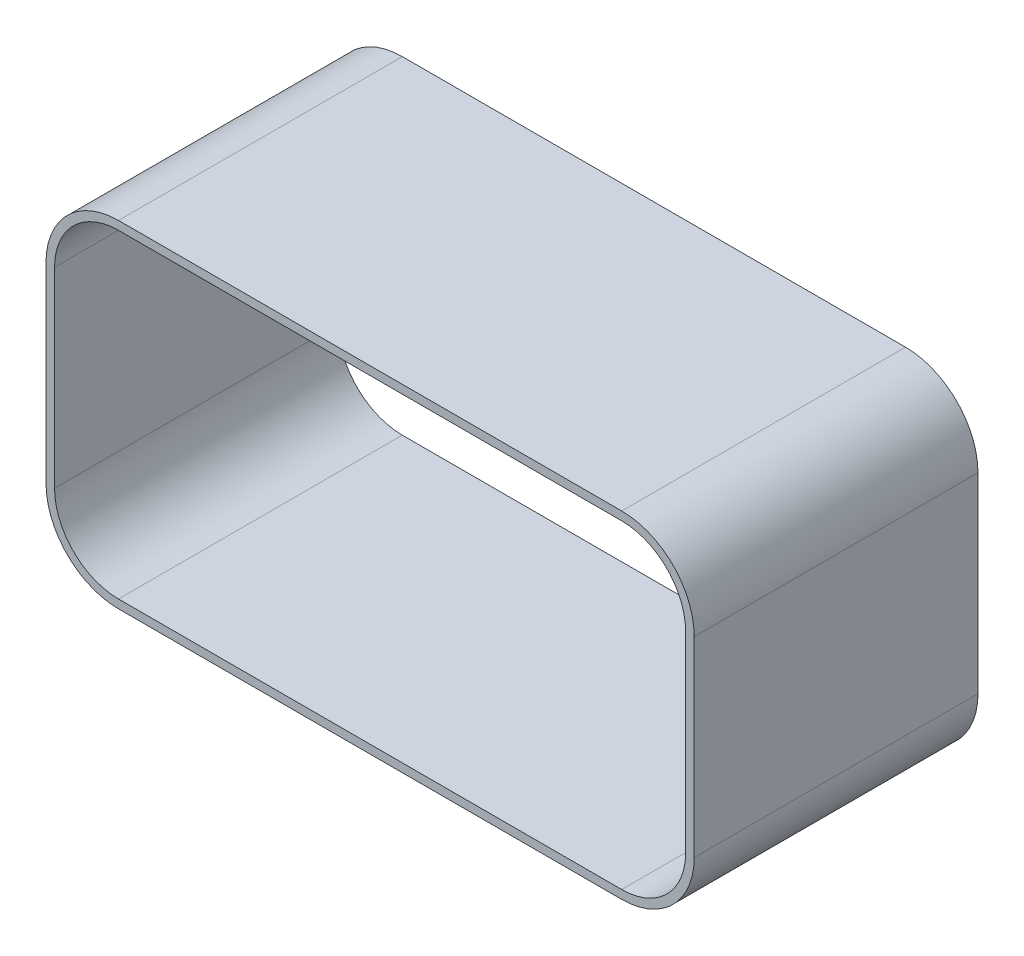
ISO-10303-21;
HEADER;
FILE_DESCRIPTION(('STEP AP214'),'2;1');
FILE_NAME('part.step','',(''),(''),'','','');
FILE_SCHEMA(('AUTOMOTIVE_DESIGN { 1 0 10303 214 1 1 1 1 }'));
ENDSEC;
DATA;
#1=APPLICATION_CONTEXT('core data for automotive mechanical design processes');
#2=APPLICATION_PROTOCOL_DEFINITION('international standard','automotive_design',2000,#1);
#3=PRODUCT_CONTEXT('',#1,'mechanical');
#4=PRODUCT('Part','Part','',(#3));
#5=PRODUCT_RELATED_PRODUCT_CATEGORY('part','',(#4));
#6=PRODUCT_DEFINITION_FORMATION('','',#4);
#7=PRODUCT_DEFINITION_CONTEXT('part definition',#1,'design');
#8=PRODUCT_DEFINITION('design','',#6,#7);
#9=PRODUCT_DEFINITION_SHAPE('','',#8);
#10=(LENGTH_UNIT() NAMED_UNIT(*) SI_UNIT(.MILLI.,.METRE.));
#11=(NAMED_UNIT(*) PLANE_ANGLE_UNIT() SI_UNIT($,.RADIAN.));
#12=(NAMED_UNIT(*) SI_UNIT($,.STERADIAN.) SOLID_ANGLE_UNIT());
#13=UNCERTAINTY_MEASURE_WITH_UNIT(LENGTH_MEASURE(1.E-05),#10,'distance_accuracy_value','');
#14=(GEOMETRIC_REPRESENTATION_CONTEXT(3) GLOBAL_UNCERTAINTY_ASSIGNED_CONTEXT((#13)) GLOBAL_UNIT_ASSIGNED_CONTEXT((#10,
#11,#12)) REPRESENTATION_CONTEXT('',''));
#15=CARTESIAN_POINT('',(0.,0.,0.));
#16=DIRECTION('',(0.,0.,1.));
#17=DIRECTION('',(1.,0.,0.));
#18=AXIS2_PLACEMENT_3D('',#15,#16,#17);
#19=CARTESIAN_POINT('',(-88.2162976903473,33.5473448633323,99.5));
#20=DIRECTION('',(0.,0.,1.));
#21=DIRECTION('',(1.,0.,0.));
#22=AXIS2_PLACEMENT_3D('',#19,#20,#21);
#23=PLANE('',#22);
#24=CARTESIAN_POINT('',(-88.2162976903473,33.5473448633323,99.5));
#25=DIRECTION('',(0.,0.,1.));
#26=DIRECTION('',(1.,0.,0.));
#27=AXIS2_PLACEMENT_3D('',#24,#25,#26);
#28=CIRCLE('',#27,25.4253280321891);
#29=CARTESIAN_POINT('',(-88.2162976903473,58.9726728955214,99.5));
#30=VERTEX_POINT('',#29);
#31=CARTESIAN_POINT('',(-113.641625722536,33.5473448633322,99.5));
#32=VERTEX_POINT('',#31);
#33=EDGE_CURVE('E242',#30,#32,#28,.T.);
#34=ORIENTED_EDGE('',*,*,#33,.T.);
#35=DIRECTION('',(0.,-1.,0.));
#36=VECTOR('',#35,1.);
#37=CARTESIAN_POINT('',(-113.641625722536,-33.5473448633323,99.5));
#38=LINE('',#37,#36);
#39=CARTESIAN_POINT('',(-113.641625722536,-33.5473448633323,99.5));
#40=VERTEX_POINT('',#39);
#41=EDGE_CURVE('E246',#32,#40,#38,.T.);
#42=ORIENTED_EDGE('',*,*,#41,.T.);
#43=CARTESIAN_POINT('',(-88.2162976903473,-33.5473448633323,99.5));
#44=DIRECTION('',(0.,0.,1.));
#45=DIRECTION('',(1.,0.,0.));
#46=AXIS2_PLACEMENT_3D('',#43,#44,#45);
#47=CIRCLE('',#46,25.4253280321891);
#48=CARTESIAN_POINT('',(-88.2162976903473,-58.9726728955214,99.5));
#49=VERTEX_POINT('',#48);
#50=EDGE_CURVE('E250',#40,#49,#47,.T.);
#51=ORIENTED_EDGE('',*,*,#50,.T.);
#52=DIRECTION('',(1.,0.,0.));
#53=VECTOR('',#52,1.);
#54=CARTESIAN_POINT('',(88.2162976903472,-58.9726728955214,99.5));
#55=LINE('',#54,#53);
#56=CARTESIAN_POINT('',(88.2162976903472,-58.9726728955215,99.5));
#57=VERTEX_POINT('',#56);
#58=EDGE_CURVE('E253',#49,#57,#55,.T.);
#59=ORIENTED_EDGE('',*,*,#58,.T.);
#60=CARTESIAN_POINT('',(88.2162976903472,-33.5473448633323,99.5));
#61=DIRECTION('',(0.,0.,1.));
#62=DIRECTION('',(1.,0.,0.));
#63=AXIS2_PLACEMENT_3D('',#60,#61,#62);
#64=CIRCLE('',#63,25.4253280321892);
#65=CARTESIAN_POINT('',(113.641625722536,-33.5473448633323,99.5));
#66=VERTEX_POINT('',#65);
#67=EDGE_CURVE('E256',#57,#66,#64,.T.);
#68=ORIENTED_EDGE('',*,*,#67,.T.);
#69=DIRECTION('',(0.,1.,0.));
#70=VECTOR('',#69,1.);
#71=CARTESIAN_POINT('',(113.641625722536,33.5473448633323,99.5));
#72=LINE('',#71,#70);
#73=CARTESIAN_POINT('',(113.641625722536,33.5473448633323,99.5));
#74=VERTEX_POINT('',#73);
#75=EDGE_CURVE('E259',#66,#74,#72,.T.);
#76=ORIENTED_EDGE('',*,*,#75,.T.);
#77=CARTESIAN_POINT('',(88.2162976903473,33.5473448633323,99.5));
#78=DIRECTION('',(0.,0.,1.));
#79=DIRECTION('',(1.,0.,0.));
#80=AXIS2_PLACEMENT_3D('',#77,#78,#79);
#81=CIRCLE('',#80,25.4253280321891);
#82=CARTESIAN_POINT('',(88.2162976903473,58.9726728955214,99.5));
#83=VERTEX_POINT('',#82);
#84=EDGE_CURVE('E262',#74,#83,#81,.T.);
#85=ORIENTED_EDGE('',*,*,#84,.T.);
#86=DIRECTION('',(-1.,0.,0.));
#87=VECTOR('',#86,1.);
#88=CARTESIAN_POINT('',(-88.2162976903473,58.9726728955214,99.5));
#89=LINE('',#88,#87);
#90=EDGE_CURVE('E265',#83,#30,#89,.T.);
#91=ORIENTED_EDGE('',*,*,#90,.T.);
#92=EDGE_LOOP('',(#34,#42,#51,#59,#68,#76,#85,#91));
#93=FACE_BOUND('',#92,.T.);
#94=DIRECTION('',(0.,-1.,0.));
#95=VECTOR('',#94,1.);
#96=CARTESIAN_POINT('',(-110.641625722536,-33.5473448633323,99.5));
#97=LINE('',#96,#95);
#98=CARTESIAN_POINT('',(-110.641625722536,33.5473448633323,99.5));
#99=VERTEX_POINT('',#98);
#100=CARTESIAN_POINT('',(-110.641625722536,-33.5473448633323,99.5));
#101=VERTEX_POINT('',#100);
#102=EDGE_CURVE('E162',#99,#101,#97,.T.);
#103=ORIENTED_EDGE('',*,*,#102,.F.);
#104=CARTESIAN_POINT('',(-88.2162976903473,33.5473448633323,99.5));
#105=DIRECTION('',(0.,0.,1.));
#106=DIRECTION('',(1.,0.,0.));
#107=AXIS2_PLACEMENT_3D('',#104,#105,#106);
#108=CIRCLE('',#107,22.4253280321891);
#109=CARTESIAN_POINT('',(-88.2162976903473,55.9726728955214,99.5));
#110=VERTEX_POINT('',#109);
#111=EDGE_CURVE('E153',#110,#99,#108,.T.);
#112=ORIENTED_EDGE('',*,*,#111,.F.);
#113=DIRECTION('',(-1.,0.,0.));
#114=VECTOR('',#113,1.);
#115=CARTESIAN_POINT('',(-88.2162976903473,55.9726728955214,99.5));
#116=LINE('',#115,#114);
#117=CARTESIAN_POINT('',(88.2162976903473,55.9726728955214,99.5));
#118=VERTEX_POINT('',#117);
#119=EDGE_CURVE('E194',#118,#110,#116,.T.);
#120=ORIENTED_EDGE('',*,*,#119,.F.);
#121=CARTESIAN_POINT('',(88.2162976903473,33.5473448633323,99.5));
#122=DIRECTION('',(0.,0.,1.));
#123=DIRECTION('',(1.,0.,0.));
#124=AXIS2_PLACEMENT_3D('',#121,#122,#123);
#125=CIRCLE('',#124,22.4253280321891);
#126=CARTESIAN_POINT('',(110.641625722536,33.5473448633323,99.5));
#127=VERTEX_POINT('',#126);
#128=EDGE_CURVE('E191',#127,#118,#125,.T.);
#129=ORIENTED_EDGE('',*,*,#128,.F.);
#130=DIRECTION('',(0.,1.,0.));
#131=VECTOR('',#130,1.);
#132=CARTESIAN_POINT('',(110.641625722536,33.5473448633323,99.5));
#133=LINE('',#132,#131);
#134=CARTESIAN_POINT('',(110.641625722536,-33.5473448633323,99.5));
#135=VERTEX_POINT('',#134);
#136=EDGE_CURVE('E188',#135,#127,#133,.T.);
#137=ORIENTED_EDGE('',*,*,#136,.F.);
#138=CARTESIAN_POINT('',(88.2162976903472,-33.5473448633323,99.5));
#139=DIRECTION('',(0.,0.,1.));
#140=DIRECTION('',(1.,0.,0.));
#141=AXIS2_PLACEMENT_3D('',#138,#139,#140);
#142=CIRCLE('',#141,22.4253280321892);
#143=CARTESIAN_POINT('',(88.2162976903472,-55.9726728955215,99.5));
#144=VERTEX_POINT('',#143);
#145=EDGE_CURVE('E185',#144,#135,#142,.T.);
#146=ORIENTED_EDGE('',*,*,#145,.F.);
#147=DIRECTION('',(1.,0.,0.));
#148=VECTOR('',#147,1.);
#149=CARTESIAN_POINT('',(88.2162976903472,-55.9726728955214,99.5));
#150=LINE('',#149,#148);
#151=CARTESIAN_POINT('',(-88.2162976903473,-55.9726728955214,99.5));
#152=VERTEX_POINT('',#151);
#153=EDGE_CURVE('E180',#152,#144,#150,.T.);
#154=ORIENTED_EDGE('',*,*,#153,.F.);
#155=CARTESIAN_POINT('',(-88.2162976903473,-33.5473448633323,99.5));
#156=DIRECTION('',(0.,0.,1.));
#157=DIRECTION('',(1.,0.,0.));
#158=AXIS2_PLACEMENT_3D('',#155,#156,#157);
#159=CIRCLE('',#158,22.4253280321891);
#160=EDGE_CURVE('E176',#101,#152,#159,.T.);
#161=ORIENTED_EDGE('',*,*,#160,.F.);
#162=EDGE_LOOP('',(#103,#112,#120,#129,#137,#146,#154,#161));
#163=FACE_BOUND('',#162,.T.);
#164=ADVANCED_FACE('F39',(#93,#163),#23,.T.);
#165=CARTESIAN_POINT('',(-88.2162976903473,33.5473448633323,0.));
#166=DIRECTION('',(0.,0.,1.));
#167=DIRECTION('',(1.,0.,0.));
#168=AXIS2_PLACEMENT_3D('',#165,#166,#167);
#169=PLANE('',#168);
#170=CARTESIAN_POINT('',(-88.2162976903473,33.5473448633323,0.));
#171=DIRECTION('',(0.,0.,1.));
#172=DIRECTION('',(1.,0.,0.));
#173=AXIS2_PLACEMENT_3D('',#170,#171,#172);
#174=CIRCLE('',#173,25.4253280321891);
#175=CARTESIAN_POINT('',(-88.2162976903473,58.9726728955214,0.));
#176=VERTEX_POINT('',#175);
#177=CARTESIAN_POINT('',(-113.641625722536,33.5473448633322,0.));
#178=VERTEX_POINT('',#177);
#179=EDGE_CURVE('E171',#176,#178,#174,.T.);
#180=ORIENTED_EDGE('',*,*,#179,.F.);
#181=DIRECTION('',(-1.,0.,0.));
#182=VECTOR('',#181,1.);
#183=CARTESIAN_POINT('',(-88.2162976903473,58.9726728955214,0.));
#184=LINE('',#183,#182);
#185=CARTESIAN_POINT('',(88.2162976903473,58.9726728955214,0.));
#186=VERTEX_POINT('',#185);
#187=EDGE_CURVE('E247',#186,#176,#184,.T.);
#188=ORIENTED_EDGE('',*,*,#187,.F.);
#189=CARTESIAN_POINT('',(88.2162976903473,33.5473448633323,0.));
#190=DIRECTION('',(0.,0.,1.));
#191=DIRECTION('',(1.,0.,0.));
#192=AXIS2_PLACEMENT_3D('',#189,#190,#191);
#193=CIRCLE('',#192,25.4253280321891);
#194=CARTESIAN_POINT('',(113.641625722536,33.5473448633323,0.));
#195=VERTEX_POINT('',#194);
#196=EDGE_CURVE('E287',#195,#186,#193,.T.);
#197=ORIENTED_EDGE('',*,*,#196,.F.);
#198=DIRECTION('',(0.,1.,0.));
#199=VECTOR('',#198,1.);
#200=CARTESIAN_POINT('',(113.641625722536,33.5473448633323,0.));
#201=LINE('',#200,#199);
#202=CARTESIAN_POINT('',(113.641625722536,-33.5473448633323,0.));
#203=VERTEX_POINT('',#202);
#204=EDGE_CURVE('E284',#203,#195,#201,.T.);
#205=ORIENTED_EDGE('',*,*,#204,.F.);
#206=CARTESIAN_POINT('',(88.2162976903472,-33.5473448633323,0.));
#207=DIRECTION('',(0.,0.,1.));
#208=DIRECTION('',(1.,0.,0.));
#209=AXIS2_PLACEMENT_3D('',#206,#207,#208);
#210=CIRCLE('',#209,25.4253280321892);
#211=CARTESIAN_POINT('',(88.2162976903472,-58.9726728955215,0.));
#212=VERTEX_POINT('',#211);
#213=EDGE_CURVE('E281',#212,#203,#210,.T.);
#214=ORIENTED_EDGE('',*,*,#213,.F.);
#215=DIRECTION('',(1.,0.,0.));
#216=VECTOR('',#215,1.);
#217=CARTESIAN_POINT('',(88.2162976903472,-58.9726728955214,0.));
#218=LINE('',#217,#216);
#219=CARTESIAN_POINT('',(-88.2162976903473,-58.9726728955214,0.));
#220=VERTEX_POINT('',#219);
#221=EDGE_CURVE('E278',#220,#212,#218,.T.);
#222=ORIENTED_EDGE('',*,*,#221,.F.);
#223=CARTESIAN_POINT('',(-88.2162976903473,-33.5473448633323,0.));
#224=DIRECTION('',(0.,0.,1.));
#225=DIRECTION('',(1.,0.,0.));
#226=AXIS2_PLACEMENT_3D('',#223,#224,#225);
#227=CIRCLE('',#226,25.4253280321891);
#228=CARTESIAN_POINT('',(-113.641625722536,-33.5473448633323,0.));
#229=VERTEX_POINT('',#228);
#230=EDGE_CURVE('E275',#229,#220,#227,.T.);
#231=ORIENTED_EDGE('',*,*,#230,.F.);
#232=DIRECTION('',(0.,-1.,0.));
#233=VECTOR('',#232,1.);
#234=CARTESIAN_POINT('',(-113.641625722536,-33.5473448633323,0.));
#235=LINE('',#234,#233);
#236=EDGE_CURVE('E272',#178,#229,#235,.T.);
#237=ORIENTED_EDGE('',*,*,#236,.F.);
#238=EDGE_LOOP('',(#180,#188,#197,#205,#214,#222,#231,#237));
#239=FACE_BOUND('',#238,.T.);
#240=CARTESIAN_POINT('',(-88.2162976903473,33.5473448633323,0.));
#241=DIRECTION('',(0.,0.,1.));
#242=DIRECTION('',(1.,0.,0.));
#243=AXIS2_PLACEMENT_3D('',#240,#241,#242);
#244=CIRCLE('',#243,22.4253280321891);
#245=CARTESIAN_POINT('',(-88.2162976903473,55.9726728955214,0.));
#246=VERTEX_POINT('',#245);
#247=CARTESIAN_POINT('',(-110.641625722536,33.5473448633323,0.));
#248=VERTEX_POINT('',#247);
#249=EDGE_CURVE('E63',#246,#248,#244,.T.);
#250=ORIENTED_EDGE('',*,*,#249,.T.);
#251=DIRECTION('',(0.,-1.,0.));
#252=VECTOR('',#251,1.);
#253=CARTESIAN_POINT('',(-110.641625722536,-33.5473448633323,0.));
#254=LINE('',#253,#252);
#255=CARTESIAN_POINT('',(-110.641625722536,-33.5473448633323,0.));
#256=VERTEX_POINT('',#255);
#257=EDGE_CURVE('E169',#248,#256,#254,.T.);
#258=ORIENTED_EDGE('',*,*,#257,.T.);
#259=CARTESIAN_POINT('',(-88.2162976903473,-33.5473448633323,0.));
#260=DIRECTION('',(0.,0.,1.));
#261=DIRECTION('',(1.,0.,0.));
#262=AXIS2_PLACEMENT_3D('',#259,#260,#261);
#263=CIRCLE('',#262,22.4253280321891);
#264=CARTESIAN_POINT('',(-88.2162976903473,-55.9726728955214,0.));
#265=VERTEX_POINT('',#264);
#266=EDGE_CURVE('E201',#256,#265,#263,.T.);
#267=ORIENTED_EDGE('',*,*,#266,.T.);
#268=DIRECTION('',(1.,0.,0.));
#269=VECTOR('',#268,1.);
#270=CARTESIAN_POINT('',(88.2162976903472,-55.9726728955214,0.));
#271=LINE('',#270,#269);
#272=CARTESIAN_POINT('',(88.2162976903472,-55.9726728955215,0.));
#273=VERTEX_POINT('',#272);
#274=EDGE_CURVE('E205',#265,#273,#271,.T.);
#275=ORIENTED_EDGE('',*,*,#274,.T.);
#276=CARTESIAN_POINT('',(88.2162976903472,-33.5473448633323,0.));
#277=DIRECTION('',(0.,0.,1.));
#278=DIRECTION('',(1.,0.,0.));
#279=AXIS2_PLACEMENT_3D('',#276,#277,#278);
#280=CIRCLE('',#279,22.4253280321892);
#281=CARTESIAN_POINT('',(110.641625722536,-33.5473448633323,0.));
#282=VERTEX_POINT('',#281);
#283=EDGE_CURVE('E209',#273,#282,#280,.T.);
#284=ORIENTED_EDGE('',*,*,#283,.T.);
#285=DIRECTION('',(0.,1.,0.));
#286=VECTOR('',#285,1.);
#287=CARTESIAN_POINT('',(110.641625722536,33.5473448633323,0.));
#288=LINE('',#287,#286);
#289=CARTESIAN_POINT('',(110.641625722536,33.5473448633323,0.));
#290=VERTEX_POINT('',#289);
#291=EDGE_CURVE('E213',#282,#290,#288,.T.);
#292=ORIENTED_EDGE('',*,*,#291,.T.);
#293=CARTESIAN_POINT('',(88.2162976903473,33.5473448633323,0.));
#294=DIRECTION('',(0.,0.,1.));
#295=DIRECTION('',(1.,0.,0.));
#296=AXIS2_PLACEMENT_3D('',#293,#294,#295);
#297=CIRCLE('',#296,22.4253280321891);
#298=CARTESIAN_POINT('',(88.2162976903473,55.9726728955214,0.));
#299=VERTEX_POINT('',#298);
#300=EDGE_CURVE('E217',#290,#299,#297,.T.);
#301=ORIENTED_EDGE('',*,*,#300,.T.);
#302=DIRECTION('',(-1.,0.,0.));
#303=VECTOR('',#302,1.);
#304=CARTESIAN_POINT('',(-88.2162976903473,55.9726728955214,0.));
#305=LINE('',#304,#303);
#306=EDGE_CURVE('E163',#299,#246,#305,.T.);
#307=ORIENTED_EDGE('',*,*,#306,.T.);
#308=EDGE_LOOP('',(#250,#258,#267,#275,#284,#292,#301,#307));
#309=FACE_BOUND('',#308,.T.);
#310=ADVANCED_FACE('F326',(#239,#309),#169,.F.);
#311=CARTESIAN_POINT('',(-88.2162976903473,33.5473448633323,99.5));
#312=DIRECTION('',(0.,0.,-1.));
#313=DIRECTION('',(-1.,0.,0.));
#314=AXIS2_PLACEMENT_3D('',#311,#312,#313);
#315=CYLINDRICAL_SURFACE('',#314,25.4253280321891);
#316=ORIENTED_EDGE('',*,*,#179,.T.);
#317=DIRECTION('',(0.,0.,-1.));
#318=VECTOR('',#317,1.);
#319=CARTESIAN_POINT('',(-113.641625722536,33.5473448633322,99.5));
#320=LINE('',#319,#318);
#321=EDGE_CURVE('E11',#32,#178,#320,.T.);
#322=ORIENTED_EDGE('',*,*,#321,.F.);
#323=ORIENTED_EDGE('',*,*,#33,.F.);
#324=DIRECTION('',(0.,0.,-1.));
#325=VECTOR('',#324,1.);
#326=CARTESIAN_POINT('',(-88.2162976903473,58.9726728955214,99.5));
#327=LINE('',#326,#325);
#328=EDGE_CURVE('E268',#30,#176,#327,.T.);
#329=ORIENTED_EDGE('',*,*,#328,.T.);
#330=EDGE_LOOP('',(#316,#322,#323,#329));
#331=FACE_BOUND('',#330,.T.);
#332=ADVANCED_FACE('F41',(#331),#315,.T.);
#333=CARTESIAN_POINT('',(-113.641625722536,-33.5473448633323,99.5));
#334=DIRECTION('',(1.,0.,0.));
#335=DIRECTION('',(0.,0.,-1.));
#336=AXIS2_PLACEMENT_3D('',#333,#334,#335);
#337=PLANE('',#336);
#338=ORIENTED_EDGE('',*,*,#236,.T.);
#339=DIRECTION('',(0.,0.,-1.));
#340=VECTOR('',#339,1.);
#341=CARTESIAN_POINT('',(-113.641625722536,-33.5473448633323,99.5));
#342=LINE('',#341,#340);
#343=EDGE_CURVE('E48',#40,#229,#342,.T.);
#344=ORIENTED_EDGE('',*,*,#343,.F.);
#345=ORIENTED_EDGE('',*,*,#41,.F.);
#346=ORIENTED_EDGE('',*,*,#321,.T.);
#347=EDGE_LOOP('',(#338,#344,#345,#346));
#348=FACE_BOUND('',#347,.T.);
#349=ADVANCED_FACE('F343',(#348),#337,.F.);
#350=CARTESIAN_POINT('',(-88.2162976903473,-33.5473448633323,99.5));
#351=DIRECTION('',(0.,0.,-1.));
#352=DIRECTION('',(-1.,0.,0.));
#353=AXIS2_PLACEMENT_3D('',#350,#351,#352);
#354=CYLINDRICAL_SURFACE('',#353,25.4253280321891);
#355=ORIENTED_EDGE('',*,*,#230,.T.);
#356=DIRECTION('',(0.,0.,-1.));
#357=VECTOR('',#356,1.);
#358=CARTESIAN_POINT('',(-88.2162976903473,-58.9726728955214,99.5));
#359=LINE('',#358,#357);
#360=EDGE_CURVE('E311',#49,#220,#359,.T.);
#361=ORIENTED_EDGE('',*,*,#360,.F.);
#362=ORIENTED_EDGE('',*,*,#50,.F.);
#363=ORIENTED_EDGE('',*,*,#343,.T.);
#364=EDGE_LOOP('',(#355,#361,#362,#363));
#365=FACE_BOUND('',#364,.T.);
#366=ADVANCED_FACE('F320',(#365),#354,.T.);
#367=CARTESIAN_POINT('',(88.2162976903472,-58.9726728955214,99.5));
#368=DIRECTION('',(0.,1.,0.));
#369=DIRECTION('',(-1.,0.,0.));
#370=AXIS2_PLACEMENT_3D('',#367,#368,#369);
#371=PLANE('',#370);
#372=ORIENTED_EDGE('',*,*,#221,.T.);
#373=DIRECTION('',(0.,0.,-1.));
#374=VECTOR('',#373,1.);
#375=CARTESIAN_POINT('',(88.2162976903472,-58.9726728955215,99.5));
#376=LINE('',#375,#374);
#377=EDGE_CURVE('E307',#57,#212,#376,.T.);
#378=ORIENTED_EDGE('',*,*,#377,.F.);
#379=ORIENTED_EDGE('',*,*,#58,.F.);
#380=ORIENTED_EDGE('',*,*,#360,.T.);
#381=EDGE_LOOP('',(#372,#378,#379,#380));
#382=FACE_BOUND('',#381,.T.);
#383=ADVANCED_FACE('F332',(#382),#371,.F.);
#384=CARTESIAN_POINT('',(88.2162976903472,-33.5473448633323,99.5));
#385=DIRECTION('',(0.,0.,-1.));
#386=DIRECTION('',(-1.,0.,0.));
#387=AXIS2_PLACEMENT_3D('',#384,#385,#386);
#388=CYLINDRICAL_SURFACE('',#387,25.4253280321892);
#389=ORIENTED_EDGE('',*,*,#213,.T.);
#390=DIRECTION('',(0.,0.,-1.));
#391=VECTOR('',#390,1.);
#392=CARTESIAN_POINT('',(113.641625722536,-33.5473448633323,99.5));
#393=LINE('',#392,#391);
#394=EDGE_CURVE('E303',#66,#203,#393,.T.);
#395=ORIENTED_EDGE('',*,*,#394,.F.);
#396=ORIENTED_EDGE('',*,*,#67,.F.);
#397=ORIENTED_EDGE('',*,*,#377,.T.);
#398=EDGE_LOOP('',(#389,#395,#396,#397));
#399=FACE_BOUND('',#398,.T.);
#400=ADVANCED_FACE('F336',(#399),#388,.T.);
#401=CARTESIAN_POINT('',(113.641625722536,33.5473448633323,99.5));
#402=DIRECTION('',(-1.,0.,0.));
#403=DIRECTION('',(0.,-1.,0.));
#404=AXIS2_PLACEMENT_3D('',#401,#402,#403);
#405=PLANE('',#404);
#406=ORIENTED_EDGE('',*,*,#204,.T.);
#407=DIRECTION('',(0.,0.,-1.));
#408=VECTOR('',#407,1.);
#409=CARTESIAN_POINT('',(113.641625722536,33.5473448633323,99.5));
#410=LINE('',#409,#408);
#411=EDGE_CURVE('E299',#74,#195,#410,.T.);
#412=ORIENTED_EDGE('',*,*,#411,.F.);
#413=ORIENTED_EDGE('',*,*,#75,.F.);
#414=ORIENTED_EDGE('',*,*,#394,.T.);
#415=EDGE_LOOP('',(#406,#412,#413,#414));
#416=FACE_BOUND('',#415,.T.);
#417=ADVANCED_FACE('F356',(#416),#405,.F.);
#418=CARTESIAN_POINT('',(88.2162976903473,33.5473448633323,99.5));
#419=DIRECTION('',(0.,0.,-1.));
#420=DIRECTION('',(-1.,0.,0.));
#421=AXIS2_PLACEMENT_3D('',#418,#419,#420);
#422=CYLINDRICAL_SURFACE('',#421,25.4253280321891);
#423=ORIENTED_EDGE('',*,*,#196,.T.);
#424=DIRECTION('',(0.,0.,-1.));
#425=VECTOR('',#424,1.);
#426=CARTESIAN_POINT('',(88.2162976903473,58.9726728955214,99.5));
#427=LINE('',#426,#425);
#428=EDGE_CURVE('E295',#83,#186,#427,.T.);
#429=ORIENTED_EDGE('',*,*,#428,.F.);
#430=ORIENTED_EDGE('',*,*,#84,.F.);
#431=ORIENTED_EDGE('',*,*,#411,.T.);
#432=EDGE_LOOP('',(#423,#429,#430,#431));
#433=FACE_BOUND('',#432,.T.);
#434=ADVANCED_FACE('F354',(#433),#422,.T.);
#435=CARTESIAN_POINT('',(-88.2162976903473,58.9726728955214,99.5));
#436=DIRECTION('',(0.,-1.,0.));
#437=DIRECTION('',(0.,0.,-1.));
#438=AXIS2_PLACEMENT_3D('',#435,#436,#437);
#439=PLANE('',#438);
#440=ORIENTED_EDGE('',*,*,#187,.T.);
#441=ORIENTED_EDGE('',*,*,#328,.F.);
#442=ORIENTED_EDGE('',*,*,#90,.F.);
#443=ORIENTED_EDGE('',*,*,#428,.T.);
#444=EDGE_LOOP('',(#440,#441,#442,#443));
#445=FACE_BOUND('',#444,.T.);
#446=ADVANCED_FACE('F349',(#445),#439,.F.);
#447=CARTESIAN_POINT('',(-88.2162976903473,33.5473448633323,99.5));
#448=DIRECTION('',(0.,0.,-1.));
#449=DIRECTION('',(-1.,0.,0.));
#450=AXIS2_PLACEMENT_3D('',#447,#448,#449);
#451=CYLINDRICAL_SURFACE('',#450,22.4253280321891);
#452=ORIENTED_EDGE('',*,*,#249,.F.);
#453=DIRECTION('',(0.,0.,-1.));
#454=VECTOR('',#453,1.);
#455=CARTESIAN_POINT('',(-88.2162976903473,55.9726728955214,99.5));
#456=LINE('',#455,#454);
#457=EDGE_CURVE('E157',#110,#246,#456,.T.);
#458=ORIENTED_EDGE('',*,*,#457,.F.);
#459=ORIENTED_EDGE('',*,*,#111,.T.);
#460=DIRECTION('',(0.,0.,-1.));
#461=VECTOR('',#460,1.);
#462=CARTESIAN_POINT('',(-110.641625722536,33.5473448633323,99.5));
#463=LINE('',#462,#461);
#464=EDGE_CURVE('E156',#99,#248,#463,.T.);
#465=ORIENTED_EDGE('',*,*,#464,.T.);
#466=EDGE_LOOP('',(#452,#458,#459,#465));
#467=FACE_BOUND('',#466,.T.);
#468=ADVANCED_FACE('F155',(#467),#451,.F.);
#469=CARTESIAN_POINT('',(-110.641625722536,-33.5473448633323,99.5));
#470=DIRECTION('',(1.,0.,0.));
#471=DIRECTION('',(0.,0.,-1.));
#472=AXIS2_PLACEMENT_3D('',#469,#470,#471);
#473=PLANE('',#472);
#474=ORIENTED_EDGE('',*,*,#257,.F.);
#475=ORIENTED_EDGE('',*,*,#464,.F.);
#476=ORIENTED_EDGE('',*,*,#102,.T.);
#477=DIRECTION('',(0.,0.,-1.));
#478=VECTOR('',#477,1.);
#479=CARTESIAN_POINT('',(-110.641625722536,-33.5473448633323,99.5));
#480=LINE('',#479,#478);
#481=EDGE_CURVE('E172',#101,#256,#480,.T.);
#482=ORIENTED_EDGE('',*,*,#481,.T.);
#483=EDGE_LOOP('',(#474,#475,#476,#482));
#484=FACE_BOUND('',#483,.T.);
#485=ADVANCED_FACE('F166',(#484),#473,.T.);
#486=CARTESIAN_POINT('',(-88.2162976903473,-33.5473448633323,99.5));
#487=DIRECTION('',(0.,0.,-1.));
#488=DIRECTION('',(-1.,0.,0.));
#489=AXIS2_PLACEMENT_3D('',#486,#487,#488);
#490=CYLINDRICAL_SURFACE('',#489,22.4253280321891);
#491=ORIENTED_EDGE('',*,*,#266,.F.);
#492=ORIENTED_EDGE('',*,*,#481,.F.);
#493=ORIENTED_EDGE('',*,*,#160,.T.);
#494=DIRECTION('',(0.,0.,-1.));
#495=VECTOR('',#494,1.);
#496=CARTESIAN_POINT('',(-88.2162976903473,-55.9726728955214,99.5));
#497=LINE('',#496,#495);
#498=EDGE_CURVE('E237',#152,#265,#497,.T.);
#499=ORIENTED_EDGE('',*,*,#498,.T.);
#500=EDGE_LOOP('',(#491,#492,#493,#499));
#501=FACE_BOUND('',#500,.T.);
#502=ADVANCED_FACE('F381',(#501),#490,.F.);
#503=CARTESIAN_POINT('',(88.2162976903472,-55.9726728955214,99.5));
#504=DIRECTION('',(0.,1.,0.));
#505=DIRECTION('',(-1.,0.,0.));
#506=AXIS2_PLACEMENT_3D('',#503,#504,#505);
#507=PLANE('',#506);
#508=ORIENTED_EDGE('',*,*,#274,.F.);
#509=ORIENTED_EDGE('',*,*,#498,.F.);
#510=ORIENTED_EDGE('',*,*,#153,.T.);
#511=DIRECTION('',(0.,0.,-1.));
#512=VECTOR('',#511,1.);
#513=CARTESIAN_POINT('',(88.2162976903472,-55.9726728955215,99.5));
#514=LINE('',#513,#512);
#515=EDGE_CURVE('E234',#144,#273,#514,.T.);
#516=ORIENTED_EDGE('',*,*,#515,.T.);
#517=EDGE_LOOP('',(#508,#509,#510,#516));
#518=FACE_BOUND('',#517,.T.);
#519=ADVANCED_FACE('F385',(#518),#507,.T.);
#520=CARTESIAN_POINT('',(88.2162976903472,-33.5473448633323,99.5));
#521=DIRECTION('',(0.,0.,-1.));
#522=DIRECTION('',(-1.,0.,0.));
#523=AXIS2_PLACEMENT_3D('',#520,#521,#522);
#524=CYLINDRICAL_SURFACE('',#523,22.4253280321892);
#525=ORIENTED_EDGE('',*,*,#283,.F.);
#526=ORIENTED_EDGE('',*,*,#515,.F.);
#527=ORIENTED_EDGE('',*,*,#145,.T.);
#528=DIRECTION('',(0.,0.,-1.));
#529=VECTOR('',#528,1.);
#530=CARTESIAN_POINT('',(110.641625722536,-33.5473448633323,99.5));
#531=LINE('',#530,#529);
#532=EDGE_CURVE('E231',#135,#282,#531,.T.);
#533=ORIENTED_EDGE('',*,*,#532,.T.);
#534=EDGE_LOOP('',(#525,#526,#527,#533));
#535=FACE_BOUND('',#534,.T.);
#536=ADVANCED_FACE('F391',(#535),#524,.F.);
#537=CARTESIAN_POINT('',(110.641625722536,33.5473448633323,99.5));
#538=DIRECTION('',(-1.,0.,0.));
#539=DIRECTION('',(0.,0.,1.));
#540=AXIS2_PLACEMENT_3D('',#537,#538,#539);
#541=PLANE('',#540);
#542=ORIENTED_EDGE('',*,*,#291,.F.);
#543=ORIENTED_EDGE('',*,*,#532,.F.);
#544=ORIENTED_EDGE('',*,*,#136,.T.);
#545=DIRECTION('',(0.,0.,-1.));
#546=VECTOR('',#545,1.);
#547=CARTESIAN_POINT('',(110.641625722536,33.5473448633323,99.5));
#548=LINE('',#547,#546);
#549=EDGE_CURVE('E228',#127,#290,#548,.T.);
#550=ORIENTED_EDGE('',*,*,#549,.T.);
#551=EDGE_LOOP('',(#542,#543,#544,#550));
#552=FACE_BOUND('',#551,.T.);
#553=ADVANCED_FACE('F395',(#552),#541,.T.);
#554=CARTESIAN_POINT('',(88.2162976903473,33.5473448633323,99.5));
#555=DIRECTION('',(0.,0.,-1.));
#556=DIRECTION('',(-1.,0.,0.));
#557=AXIS2_PLACEMENT_3D('',#554,#555,#556);
#558=CYLINDRICAL_SURFACE('',#557,22.4253280321891);
#559=ORIENTED_EDGE('',*,*,#300,.F.);
#560=ORIENTED_EDGE('',*,*,#549,.F.);
#561=ORIENTED_EDGE('',*,*,#128,.T.);
#562=DIRECTION('',(0.,0.,-1.));
#563=VECTOR('',#562,1.);
#564=CARTESIAN_POINT('',(88.2162976903473,55.9726728955214,99.5));
#565=LINE('',#564,#563);
#566=EDGE_CURVE('E55',#118,#299,#565,.T.);
#567=ORIENTED_EDGE('',*,*,#566,.T.);
#568=EDGE_LOOP('',(#559,#560,#561,#567));
#569=FACE_BOUND('',#568,.T.);
#570=ADVANCED_FACE('F399',(#569),#558,.F.);
#571=CARTESIAN_POINT('',(-88.2162976903473,55.9726728955214,99.5));
#572=DIRECTION('',(0.,-1.,0.));
#573=DIRECTION('',(0.,0.,-1.));
#574=AXIS2_PLACEMENT_3D('',#571,#572,#573);
#575=PLANE('',#574);
#576=ORIENTED_EDGE('',*,*,#306,.F.);
#577=ORIENTED_EDGE('',*,*,#566,.F.);
#578=ORIENTED_EDGE('',*,*,#119,.T.);
#579=ORIENTED_EDGE('',*,*,#457,.T.);
#580=EDGE_LOOP('',(#576,#577,#578,#579));
#581=FACE_BOUND('',#580,.T.);
#582=ADVANCED_FACE('F403',(#581),#575,.T.);
#583=CLOSED_SHELL('',(#164,#310,#332,#349,#366,#383,#400,#417,#434,#446,#468,#485,#502,#519,
#536,#553,#570,#582));
#584=MANIFOLD_SOLID_BREP('B2',#583);
#585=ADVANCED_BREP_SHAPE_REPRESENTATION('',(#18,#584),#14);
#586=SHAPE_DEFINITION_REPRESENTATION(#9,#585);
ENDSEC;
END-ISO-10303-21;
